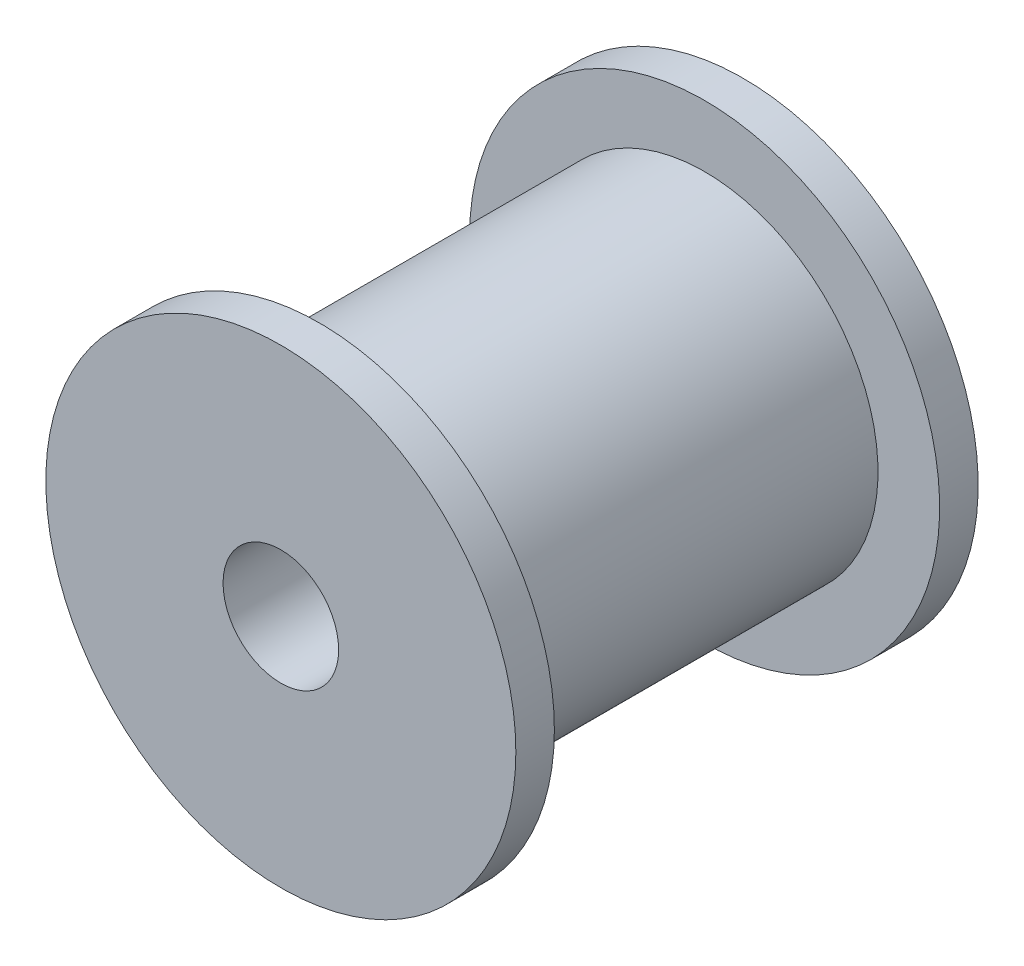
ISO-10303-21;
HEADER;
FILE_DESCRIPTION(('STEP AP214'),'2;1');
FILE_NAME('part.step','',(''),(''),'','','');
FILE_SCHEMA(('AUTOMOTIVE_DESIGN { 1 0 10303 214 1 1 1 1 }'));
ENDSEC;
DATA;
#1=APPLICATION_CONTEXT('core data for automotive mechanical design processes');
#2=APPLICATION_PROTOCOL_DEFINITION('international standard','automotive_design',2000,#1);
#3=PRODUCT_CONTEXT('',#1,'mechanical');
#4=PRODUCT('Part','Part','',(#3));
#5=PRODUCT_RELATED_PRODUCT_CATEGORY('part','',(#4));
#6=PRODUCT_DEFINITION_FORMATION('','',#4);
#7=PRODUCT_DEFINITION_CONTEXT('part definition',#1,'design');
#8=PRODUCT_DEFINITION('design','',#6,#7);
#9=PRODUCT_DEFINITION_SHAPE('','',#8);
#10=(LENGTH_UNIT() NAMED_UNIT(*) SI_UNIT(.MILLI.,.METRE.));
#11=(NAMED_UNIT(*) PLANE_ANGLE_UNIT() SI_UNIT($,.RADIAN.));
#12=(NAMED_UNIT(*) SI_UNIT($,.STERADIAN.) SOLID_ANGLE_UNIT());
#13=UNCERTAINTY_MEASURE_WITH_UNIT(LENGTH_MEASURE(1.E-05),#10,'distance_accuracy_value','');
#14=(GEOMETRIC_REPRESENTATION_CONTEXT(3) GLOBAL_UNCERTAINTY_ASSIGNED_CONTEXT((#13)) GLOBAL_UNIT_ASSIGNED_CONTEXT((#10,
#11,#12)) REPRESENTATION_CONTEXT('',''));
#15=CARTESIAN_POINT('',(0.,0.,0.));
#16=DIRECTION('',(0.,0.,1.));
#17=DIRECTION('',(1.,0.,0.));
#18=AXIS2_PLACEMENT_3D('',#15,#16,#17);
#19=CARTESIAN_POINT('',(0.,0.,1.));
#20=DIRECTION('',(0.,0.,-1.));
#21=DIRECTION('',(-1.,0.,0.));
#22=AXIS2_PLACEMENT_3D('',#19,#20,#21);
#23=CYLINDRICAL_SURFACE('',#22,1.5);
#24=CARTESIAN_POINT('',(0.,0.,1.));
#25=DIRECTION('',(0.,0.,1.));
#26=DIRECTION('',(1.,0.,0.));
#27=AXIS2_PLACEMENT_3D('',#24,#25,#26);
#28=CIRCLE('',#27,1.5);
#29=CARTESIAN_POINT('',(1.5,0.,1.));
#30=VERTEX_POINT('',#29);
#31=EDGE_CURVE('E47',#30,#30,#28,.T.);
#32=ORIENTED_EDGE('',*,*,#31,.T.);
#33=EDGE_LOOP('',(#32));
#34=FACE_BOUND('',#33,.T.);
#35=CARTESIAN_POINT('',(0.,0.,-11.));
#36=DIRECTION('',(0.,0.,-1.));
#37=DIRECTION('',(-1.,0.,0.));
#38=AXIS2_PLACEMENT_3D('',#35,#36,#37);
#39=CIRCLE('',#38,1.5);
#40=CARTESIAN_POINT('',(-1.5,0.,-11.));
#41=VERTEX_POINT('',#40);
#42=EDGE_CURVE('E68',#41,#41,#39,.T.);
#43=ORIENTED_EDGE('',*,*,#42,.T.);
#44=EDGE_LOOP('',(#43));
#45=FACE_BOUND('',#44,.T.);
#46=ADVANCED_FACE('F35',(#34,#45),#23,.F.);
#47=CARTESIAN_POINT('',(0.,0.,1.));
#48=DIRECTION('',(0.,0.,-1.));
#49=DIRECTION('',(-1.,0.,0.));
#50=AXIS2_PLACEMENT_3D('',#47,#48,#49);
#51=CYLINDRICAL_SURFACE('',#50,6.1);
#52=CARTESIAN_POINT('',(0.,0.,1.));
#53=DIRECTION('',(0.,0.,1.));
#54=DIRECTION('',(1.,0.,0.));
#55=AXIS2_PLACEMENT_3D('',#52,#53,#54);
#56=CIRCLE('',#55,6.1);
#57=CARTESIAN_POINT('',(6.1,0.,1.));
#58=VERTEX_POINT('',#57);
#59=EDGE_CURVE('E42',#58,#58,#56,.T.);
#60=ORIENTED_EDGE('',*,*,#59,.F.);
#61=EDGE_LOOP('',(#60));
#62=FACE_BOUND('',#61,.T.);
#63=CARTESIAN_POINT('',(0.,0.,0.));
#64=DIRECTION('',(0.,0.,1.));
#65=DIRECTION('',(1.,0.,0.));
#66=AXIS2_PLACEMENT_3D('',#63,#64,#65);
#67=CIRCLE('',#66,6.1);
#68=CARTESIAN_POINT('',(6.1,0.,0.));
#69=VERTEX_POINT('',#68);
#70=EDGE_CURVE('E38',#69,#69,#67,.T.);
#71=ORIENTED_EDGE('',*,*,#70,.T.);
#72=EDGE_LOOP('',(#71));
#73=FACE_BOUND('',#72,.T.);
#74=ADVANCED_FACE('F89',(#62,#73),#51,.T.);
#75=CARTESIAN_POINT('',(0.,0.,1.));
#76=DIRECTION('',(0.,0.,1.));
#77=DIRECTION('',(1.,0.,0.));
#78=AXIS2_PLACEMENT_3D('',#75,#76,#77);
#79=PLANE('',#78);
#80=ORIENTED_EDGE('',*,*,#31,.F.);
#81=EDGE_LOOP('',(#80));
#82=FACE_BOUND('',#81,.T.);
#83=ORIENTED_EDGE('',*,*,#59,.T.);
#84=EDGE_LOOP('',(#83));
#85=FACE_BOUND('',#84,.T.);
#86=ADVANCED_FACE('F93',(#82,#85),#79,.T.);
#87=CARTESIAN_POINT('',(0.,0.,0.));
#88=DIRECTION('',(0.,0.,1.));
#89=DIRECTION('',(1.,0.,0.));
#90=AXIS2_PLACEMENT_3D('',#87,#88,#89);
#91=PLANE('',#90);
#92=CARTESIAN_POINT('',(0.,0.,0.));
#93=DIRECTION('',(0.,0.,-1.));
#94=DIRECTION('',(-1.,0.,0.));
#95=AXIS2_PLACEMENT_3D('',#92,#93,#94);
#96=CIRCLE('',#95,4.5);
#97=CARTESIAN_POINT('',(-4.5,0.,0.));
#98=VERTEX_POINT('',#97);
#99=EDGE_CURVE('E10',#98,#98,#96,.T.);
#100=ORIENTED_EDGE('',*,*,#99,.F.);
#101=EDGE_LOOP('',(#100));
#102=FACE_BOUND('',#101,.T.);
#103=ORIENTED_EDGE('',*,*,#70,.F.);
#104=EDGE_LOOP('',(#103));
#105=FACE_BOUND('',#104,.T.);
#106=ADVANCED_FACE('F85',(#102,#105),#91,.F.);
#107=CARTESIAN_POINT('',(0.,0.,-10.));
#108=DIRECTION('',(0.,0.,1.));
#109=DIRECTION('',(1.,0.,0.));
#110=AXIS2_PLACEMENT_3D('',#107,#108,#109);
#111=CYLINDRICAL_SURFACE('',#110,4.5);
#112=CARTESIAN_POINT('',(0.,0.,-10.));
#113=DIRECTION('',(0.,0.,-1.));
#114=DIRECTION('',(-1.,0.,0.));
#115=AXIS2_PLACEMENT_3D('',#112,#113,#114);
#116=CIRCLE('',#115,4.5);
#117=CARTESIAN_POINT('',(-4.5,0.,-10.));
#118=VERTEX_POINT('',#117);
#119=EDGE_CURVE('E50',#118,#118,#116,.T.);
#120=ORIENTED_EDGE('',*,*,#119,.F.);
#121=EDGE_LOOP('',(#120));
#122=FACE_BOUND('',#121,.T.);
#123=ORIENTED_EDGE('',*,*,#99,.T.);
#124=EDGE_LOOP('',(#123));
#125=FACE_BOUND('',#124,.T.);
#126=ADVANCED_FACE('F77',(#122,#125),#111,.T.);
#127=CARTESIAN_POINT('',(0.,0.,-11.));
#128=DIRECTION('',(0.,0.,-1.));
#129=DIRECTION('',(-1.,0.,0.));
#130=AXIS2_PLACEMENT_3D('',#127,#128,#129);
#131=PLANE('',#130);
#132=CARTESIAN_POINT('',(0.,0.,-11.));
#133=DIRECTION('',(0.,0.,-1.));
#134=DIRECTION('',(-1.,0.,0.));
#135=AXIS2_PLACEMENT_3D('',#132,#133,#134);
#136=CIRCLE('',#135,6.1);
#137=CARTESIAN_POINT('',(-6.1,0.,-11.));
#138=VERTEX_POINT('',#137);
#139=EDGE_CURVE('E59',#138,#138,#136,.T.);
#140=ORIENTED_EDGE('',*,*,#139,.T.);
#141=EDGE_LOOP('',(#140));
#142=FACE_BOUND('',#141,.T.);
#143=ORIENTED_EDGE('',*,*,#42,.F.);
#144=EDGE_LOOP('',(#143));
#145=FACE_BOUND('',#144,.T.);
#146=ADVANCED_FACE('F74',(#142,#145),#131,.T.);
#147=CARTESIAN_POINT('',(0.,0.,-10.));
#148=DIRECTION('',(0.,0.,-1.));
#149=DIRECTION('',(-1.,0.,0.));
#150=AXIS2_PLACEMENT_3D('',#147,#148,#149);
#151=PLANE('',#150);
#152=ORIENTED_EDGE('',*,*,#119,.T.);
#153=EDGE_LOOP('',(#152));
#154=FACE_BOUND('',#153,.T.);
#155=CARTESIAN_POINT('',(0.,0.,-10.));
#156=DIRECTION('',(0.,0.,-1.));
#157=DIRECTION('',(-1.,0.,0.));
#158=AXIS2_PLACEMENT_3D('',#155,#156,#157);
#159=CIRCLE('',#158,6.1);
#160=CARTESIAN_POINT('',(-6.1,0.,-10.));
#161=VERTEX_POINT('',#160);
#162=EDGE_CURVE('E63',#161,#161,#159,.T.);
#163=ORIENTED_EDGE('',*,*,#162,.F.);
#164=EDGE_LOOP('',(#163));
#165=FACE_BOUND('',#164,.T.);
#166=ADVANCED_FACE('F76',(#154,#165),#151,.F.);
#167=CARTESIAN_POINT('',(0.,0.,-11.));
#168=DIRECTION('',(0.,0.,1.));
#169=DIRECTION('',(1.,0.,0.));
#170=AXIS2_PLACEMENT_3D('',#167,#168,#169);
#171=CYLINDRICAL_SURFACE('',#170,6.1);
#172=ORIENTED_EDGE('',*,*,#139,.F.);
#173=EDGE_LOOP('',(#172));
#174=FACE_BOUND('',#173,.T.);
#175=ORIENTED_EDGE('',*,*,#162,.T.);
#176=EDGE_LOOP('',(#175));
#177=FACE_BOUND('',#176,.T.);
#178=ADVANCED_FACE('F83',(#174,#177),#171,.T.);
#179=CLOSED_SHELL('',(#46,#74,#86,#106,#126,#146,#166,#178));
#180=MANIFOLD_SOLID_BREP('B2',#179);
#181=ADVANCED_BREP_SHAPE_REPRESENTATION('',(#18,#180),#14);
#182=SHAPE_DEFINITION_REPRESENTATION(#9,#181);
ENDSEC;
END-ISO-10303-21;
